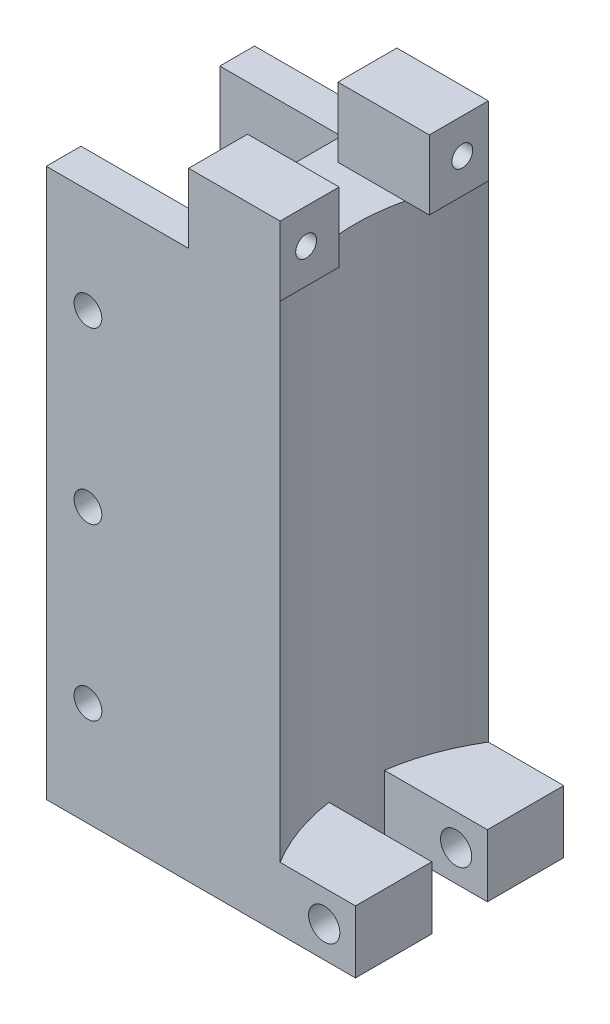
ISO-10303-21;
HEADER;
FILE_DESCRIPTION(('STEP AP214'),'2;1');
FILE_NAME('part.step','',(''),(''),'','','');
FILE_SCHEMA(('AUTOMOTIVE_DESIGN { 1 0 10303 214 1 1 1 1 }'));
ENDSEC;
DATA;
#1=APPLICATION_CONTEXT('core data for automotive mechanical design processes');
#2=APPLICATION_PROTOCOL_DEFINITION('international standard','automotive_design',2000,#1);
#3=PRODUCT_CONTEXT('',#1,'mechanical');
#4=PRODUCT('Part','Part','',(#3));
#5=PRODUCT_RELATED_PRODUCT_CATEGORY('part','',(#4));
#6=PRODUCT_DEFINITION_FORMATION('','',#4);
#7=PRODUCT_DEFINITION_CONTEXT('part definition',#1,'design');
#8=PRODUCT_DEFINITION('design','',#6,#7);
#9=PRODUCT_DEFINITION_SHAPE('','',#8);
#10=(LENGTH_UNIT() NAMED_UNIT(*) SI_UNIT(.MILLI.,.METRE.));
#11=(NAMED_UNIT(*) PLANE_ANGLE_UNIT() SI_UNIT($,.RADIAN.));
#12=(NAMED_UNIT(*) SI_UNIT($,.STERADIAN.) SOLID_ANGLE_UNIT());
#13=UNCERTAINTY_MEASURE_WITH_UNIT(LENGTH_MEASURE(1.E-05),#10,'distance_accuracy_value','');
#14=(GEOMETRIC_REPRESENTATION_CONTEXT(3) GLOBAL_UNCERTAINTY_ASSIGNED_CONTEXT((#13)) GLOBAL_UNIT_ASSIGNED_CONTEXT((#10,
#11,#12)) REPRESENTATION_CONTEXT('',''));
#15=CARTESIAN_POINT('',(0.,0.,0.));
#16=DIRECTION('',(0.,0.,1.));
#17=DIRECTION('',(1.,0.,0.));
#18=AXIS2_PLACEMENT_3D('',#15,#16,#17);
#19=CARTESIAN_POINT('',(8.84,39.5,-15.01));
#20=DIRECTION('',(1.,0.,0.));
#21=DIRECTION('',(0.,1.,0.));
#22=AXIS2_PLACEMENT_3D('',#19,#20,#21);
#23=PLANE('',#22);
#24=CARTESIAN_POINT('',(8.84,44.5,11.2500000000003));
#25=DIRECTION('',(-1.,0.,0.));
#26=DIRECTION('',(0.,0.,1.));
#27=AXIS2_PLACEMENT_3D('',#24,#25,#26);
#28=CIRCLE('',#27,1.5);
#29=CARTESIAN_POINT('',(8.84,44.5,12.7500000000003));
#30=VERTEX_POINT('',#29);
#31=EDGE_CURVE('E39',#30,#30,#28,.T.);
#32=ORIENTED_EDGE('',*,*,#31,.T.);
#33=EDGE_LOOP('',(#32));
#34=FACE_BOUND('',#33,.T.);
#35=DIRECTION('',(0.,-1.,0.));
#36=VECTOR('',#35,1.);
#37=CARTESIAN_POINT('',(8.84,49.5,6.5));
#38=LINE('',#37,#36);
#39=CARTESIAN_POINT('',(8.84,49.5,6.5));
#40=VERTEX_POINT('',#39);
#41=CARTESIAN_POINT('',(8.84,39.5,6.5));
#42=VERTEX_POINT('',#41);
#43=EDGE_CURVE('E343',#40,#42,#38,.T.);
#44=ORIENTED_EDGE('',*,*,#43,.F.);
#45=DIRECTION('',(0.,0.,-1.));
#46=VECTOR('',#45,1.);
#47=CARTESIAN_POINT('',(8.84,49.5,0.));
#48=LINE('',#47,#46);
#49=CARTESIAN_POINT('',(8.84,49.5,15.));
#50=VERTEX_POINT('',#49);
#51=EDGE_CURVE('E220',#50,#40,#48,.T.);
#52=ORIENTED_EDGE('',*,*,#51,.F.);
#53=DIRECTION('',(0.,-1.,0.));
#54=VECTOR('',#53,1.);
#55=CARTESIAN_POINT('',(8.83999999999999,0.,15.));
#56=LINE('',#55,#54);
#57=CARTESIAN_POINT('',(8.84,39.5,15.));
#58=VERTEX_POINT('',#57);
#59=EDGE_CURVE('E192',#50,#58,#56,.T.);
#60=ORIENTED_EDGE('',*,*,#59,.T.);
#61=DIRECTION('',(0.,0.,-1.));
#62=VECTOR('',#61,1.);
#63=CARTESIAN_POINT('',(8.84,39.5,0.));
#64=LINE('',#63,#62);
#65=EDGE_CURVE('E218',#58,#42,#64,.T.);
#66=ORIENTED_EDGE('',*,*,#65,.T.);
#67=EDGE_LOOP('',(#44,#52,#60,#66));
#68=FACE_BOUND('',#67,.T.);
#69=ADVANCED_FACE('F35',(#34,#68),#23,.T.);
#70=CARTESIAN_POINT('',(8.84,44.5,-11.25));
#71=DIRECTION('',(-1.,0.,0.));
#72=DIRECTION('',(0.,0.,1.));
#73=AXIS2_PLACEMENT_3D('',#70,#71,#72);
#74=CIRCLE('',#73,1.5);
#75=CARTESIAN_POINT('',(8.84,44.5,-9.75));
#76=VERTEX_POINT('',#75);
#77=EDGE_CURVE('E231',#76,#76,#74,.T.);
#78=ORIENTED_EDGE('',*,*,#77,.T.);
#79=EDGE_LOOP('',(#78));
#80=FACE_BOUND('',#79,.T.);
#81=DIRECTION('',(0.,-1.,0.));
#82=VECTOR('',#81,1.);
#83=CARTESIAN_POINT('',(8.83999999999999,0.,-15.));
#84=LINE('',#83,#82);
#85=CARTESIAN_POINT('',(8.84,49.5,-15.));
#86=VERTEX_POINT('',#85);
#87=CARTESIAN_POINT('',(8.84,39.5,-15.));
#88=VERTEX_POINT('',#87);
#89=EDGE_CURVE('E52',#86,#88,#84,.T.);
#90=ORIENTED_EDGE('',*,*,#89,.F.);
#91=CARTESIAN_POINT('',(8.84,49.5,-6.5));
#92=VERTEX_POINT('',#91);
#93=EDGE_CURVE('E346',#92,#86,#48,.T.);
#94=ORIENTED_EDGE('',*,*,#93,.F.);
#95=DIRECTION('',(0.,-1.,0.));
#96=VECTOR('',#95,1.);
#97=CARTESIAN_POINT('',(8.84,49.5,-6.5));
#98=LINE('',#97,#96);
#99=CARTESIAN_POINT('',(8.84,39.5,-6.5));
#100=VERTEX_POINT('',#99);
#101=EDGE_CURVE('E226',#92,#100,#98,.T.);
#102=ORIENTED_EDGE('',*,*,#101,.T.);
#103=EDGE_CURVE('E224',#100,#88,#64,.T.);
#104=ORIENTED_EDGE('',*,*,#103,.T.);
#105=EDGE_LOOP('',(#90,#94,#102,#104));
#106=FACE_BOUND('',#105,.T.);
#107=ADVANCED_FACE('F278',(#80,#106),#23,.T.);
#108=CARTESIAN_POINT('',(-7.34,-39.5,10.));
#109=DIRECTION('',(0.,0.,1.));
#110=DIRECTION('',(0.,-1.,0.));
#111=AXIS2_PLACEMENT_3D('',#108,#109,#110);
#112=PLANE('',#111);
#113=CARTESIAN_POINT('',(-18.84,24.5,10.));
#114=DIRECTION('',(0.,0.,1.));
#115=DIRECTION('',(0.,-1.,0.));
#116=AXIS2_PLACEMENT_3D('',#113,#114,#115);
#117=CIRCLE('',#116,2.);
#118=CARTESIAN_POINT('',(-18.84,22.5,10.));
#119=VERTEX_POINT('',#118);
#120=EDGE_CURVE('E383',#119,#119,#117,.T.);
#121=ORIENTED_EDGE('',*,*,#120,.T.);
#122=EDGE_LOOP('',(#121));
#123=FACE_BOUND('',#122,.T.);
#124=CARTESIAN_POINT('',(-18.84,-24.5,10.));
#125=DIRECTION('',(0.,0.,1.));
#126=DIRECTION('',(0.,-1.,0.));
#127=AXIS2_PLACEMENT_3D('',#124,#125,#126);
#128=CIRCLE('',#127,2.);
#129=CARTESIAN_POINT('',(-18.84,-26.5,10.));
#130=VERTEX_POINT('',#129);
#131=EDGE_CURVE('E373',#130,#130,#128,.T.);
#132=ORIENTED_EDGE('',*,*,#131,.T.);
#133=EDGE_LOOP('',(#132));
#134=FACE_BOUND('',#133,.T.);
#135=CARTESIAN_POINT('',(-18.8399999999999,0.,10.));
#136=DIRECTION('',(0.,0.,1.));
#137=DIRECTION('',(0.,-1.,0.));
#138=AXIS2_PLACEMENT_3D('',#135,#136,#137);
#139=CIRCLE('',#138,2.);
#140=CARTESIAN_POINT('',(-18.8399999999999,-2.,10.));
#141=VERTEX_POINT('',#140);
#142=EDGE_CURVE('E357',#141,#141,#139,.T.);
#143=ORIENTED_EDGE('',*,*,#142,.T.);
#144=EDGE_LOOP('',(#143));
#145=FACE_BOUND('',#144,.T.);
#146=DIRECTION('',(0.,1.,0.));
#147=VECTOR('',#146,1.);
#148=CARTESIAN_POINT('',(-24.84,0.,10.));
#149=LINE('',#148,#147);
#150=CARTESIAN_POINT('',(-24.84,-39.5,10.));
#151=VERTEX_POINT('',#150);
#152=CARTESIAN_POINT('',(-24.84,39.5,10.));
#153=VERTEX_POINT('',#152);
#154=EDGE_CURVE('E484',#151,#153,#149,.T.);
#155=ORIENTED_EDGE('',*,*,#154,.T.);
#156=DIRECTION('',(-1.,0.,0.));
#157=VECTOR('',#156,1.);
#158=CARTESIAN_POINT('',(-7.34,39.5,10.));
#159=LINE('',#158,#157);
#160=CARTESIAN_POINT('',(-7.34,39.5,10.));
#161=VERTEX_POINT('',#160);
#162=EDGE_CURVE('E408',#161,#153,#159,.T.);
#163=ORIENTED_EDGE('',*,*,#162,.F.);
#164=DIRECTION('',(0.,1.,0.));
#165=VECTOR('',#164,1.);
#166=CARTESIAN_POINT('',(-7.34,-39.5,10.));
#167=LINE('',#166,#165);
#168=CARTESIAN_POINT('',(-7.34,-39.5,10.));
#169=VERTEX_POINT('',#168);
#170=EDGE_CURVE('E399',#169,#161,#167,.T.);
#171=ORIENTED_EDGE('',*,*,#170,.F.);
#172=DIRECTION('',(-1.,0.,0.));
#173=VECTOR('',#172,1.);
#174=CARTESIAN_POINT('',(-7.34,-39.5,10.));
#175=LINE('',#174,#173);
#176=EDGE_CURVE('E412',#169,#151,#175,.T.);
#177=ORIENTED_EDGE('',*,*,#176,.T.);
#178=EDGE_LOOP('',(#155,#163,#171,#177));
#179=FACE_BOUND('',#178,.T.);
#180=ADVANCED_FACE('F275',(#123,#134,#145,#179),#112,.F.);
#181=CARTESIAN_POINT('',(-7.34,0.,0.));
#182=DIRECTION('',(1.,0.,0.));
#183=DIRECTION('',(0.,0.,-1.));
#184=AXIS2_PLACEMENT_3D('',#181,#182,#183);
#185=PLANE('',#184);
#186=DIRECTION('',(0.,-1.,0.));
#187=VECTOR('',#186,1.);
#188=CARTESIAN_POINT('',(-7.34,-39.5,-10.));
#189=LINE('',#188,#187);
#190=CARTESIAN_POINT('',(-7.34,39.5,-10.));
#191=VERTEX_POINT('',#190);
#192=CARTESIAN_POINT('',(-7.34,-39.5,-10.));
#193=VERTEX_POINT('',#192);
#194=EDGE_CURVE('E393',#191,#193,#189,.T.);
#195=ORIENTED_EDGE('',*,*,#194,.T.);
#196=DIRECTION('',(0.,0.,1.));
#197=VECTOR('',#196,1.);
#198=CARTESIAN_POINT('',(-7.34,-39.5,-10.));
#199=LINE('',#198,#197);
#200=EDGE_CURVE('E396',#193,#169,#199,.T.);
#201=ORIENTED_EDGE('',*,*,#200,.T.);
#202=ORIENTED_EDGE('',*,*,#170,.T.);
#203=DIRECTION('',(0.,0.,-1.));
#204=VECTOR('',#203,1.);
#205=CARTESIAN_POINT('',(-7.34,39.5,-10.));
#206=LINE('',#205,#204);
#207=EDGE_CURVE('E402',#161,#191,#206,.T.);
#208=ORIENTED_EDGE('',*,*,#207,.T.);
#209=EDGE_LOOP('',(#195,#201,#202,#208));
#210=FACE_BOUND('',#209,.T.);
#211=ADVANCED_FACE('F277',(#210),#185,.F.);
#212=CARTESIAN_POINT('',(-7.34,-39.5,-10.));
#213=DIRECTION('',(0.,0.,-1.));
#214=DIRECTION('',(0.,1.,0.));
#215=AXIS2_PLACEMENT_3D('',#212,#213,#214);
#216=PLANE('',#215);
#217=CARTESIAN_POINT('',(-18.84,24.5,-10.));
#218=DIRECTION('',(0.,0.,-1.));
#219=DIRECTION('',(0.,1.,0.));
#220=AXIS2_PLACEMENT_3D('',#217,#218,#219);
#221=CIRCLE('',#220,2.);
#222=CARTESIAN_POINT('',(-18.84,26.5,-10.));
#223=VERTEX_POINT('',#222);
#224=EDGE_CURVE('E384',#223,#223,#221,.T.);
#225=ORIENTED_EDGE('',*,*,#224,.T.);
#226=EDGE_LOOP('',(#225));
#227=FACE_BOUND('',#226,.T.);
#228=CARTESIAN_POINT('',(-18.84,-24.5,-10.));
#229=DIRECTION('',(0.,0.,-1.));
#230=DIRECTION('',(0.,1.,0.));
#231=AXIS2_PLACEMENT_3D('',#228,#229,#230);
#232=CIRCLE('',#231,2.);
#233=CARTESIAN_POINT('',(-18.84,-22.5,-10.));
#234=VERTEX_POINT('',#233);
#235=EDGE_CURVE('E374',#234,#234,#232,.T.);
#236=ORIENTED_EDGE('',*,*,#235,.T.);
#237=EDGE_LOOP('',(#236));
#238=FACE_BOUND('',#237,.T.);
#239=CARTESIAN_POINT('',(-18.8399999999999,0.,-10.));
#240=DIRECTION('',(0.,0.,-1.));
#241=DIRECTION('',(0.,1.,0.));
#242=AXIS2_PLACEMENT_3D('',#239,#240,#241);
#243=CIRCLE('',#242,2.);
#244=CARTESIAN_POINT('',(-18.8399999999999,2.,-10.));
#245=VERTEX_POINT('',#244);
#246=EDGE_CURVE('E364',#245,#245,#243,.T.);
#247=ORIENTED_EDGE('',*,*,#246,.T.);
#248=EDGE_LOOP('',(#247));
#249=FACE_BOUND('',#248,.T.);
#250=DIRECTION('',(0.,-1.,0.));
#251=VECTOR('',#250,1.);
#252=CARTESIAN_POINT('',(-24.84,0.,-10.));
#253=LINE('',#252,#251);
#254=CARTESIAN_POINT('',(-24.84,39.5,-10.));
#255=VERTEX_POINT('',#254);
#256=CARTESIAN_POINT('',(-24.84,-39.5,-10.));
#257=VERTEX_POINT('',#256);
#258=EDGE_CURVE('E345',#255,#257,#253,.T.);
#259=ORIENTED_EDGE('',*,*,#258,.T.);
#260=DIRECTION('',(-1.,0.,0.));
#261=VECTOR('',#260,1.);
#262=CARTESIAN_POINT('',(-7.34,-39.5,-10.));
#263=LINE('',#262,#261);
#264=EDGE_CURVE('E405',#193,#257,#263,.T.);
#265=ORIENTED_EDGE('',*,*,#264,.F.);
#266=ORIENTED_EDGE('',*,*,#194,.F.);
#267=DIRECTION('',(-1.,0.,0.));
#268=VECTOR('',#267,1.);
#269=CARTESIAN_POINT('',(-7.34,39.5,-10.));
#270=LINE('',#269,#268);
#271=EDGE_CURVE('E406',#191,#255,#270,.T.);
#272=ORIENTED_EDGE('',*,*,#271,.T.);
#273=EDGE_LOOP('',(#259,#265,#266,#272));
#274=FACE_BOUND('',#273,.T.);
#275=ADVANCED_FACE('F285',(#227,#238,#249,#274),#216,.F.);
#276=CARTESIAN_POINT('',(-8.841,0.,-4.));
#277=DIRECTION('',(0.,0.,-1.));
#278=DIRECTION('',(-1.,0.,0.));
#279=AXIS2_PLACEMENT_3D('',#276,#277,#278);
#280=PLANE('',#279);
#281=DIRECTION('',(0.,1.,0.));
#282=VECTOR('',#281,1.);
#283=CARTESIAN_POINT('',(4.88287123180948,-30.5,-4.));
#284=LINE('',#283,#282);
#285=CARTESIAN_POINT('',(4.88287123180948,-30.5,-4.));
#286=VERTEX_POINT('',#285);
#287=CARTESIAN_POINT('',(4.88287123180948,-39.5,-4.));
#288=VERTEX_POINT('',#287);
#289=EDGE_CURVE('E436',#286,#288,#284,.F.);
#290=ORIENTED_EDGE('',*,*,#289,.T.);
#291=DIRECTION('',(1.,0.,0.));
#292=VECTOR('',#291,1.);
#293=CARTESIAN_POINT('',(-8.841,-39.5,-4.));
#294=LINE('',#293,#292);
#295=CARTESIAN_POINT('',(19.7,-39.5,-4.));
#296=VERTEX_POINT('',#295);
#297=EDGE_CURVE('E441',#288,#296,#294,.T.);
#298=ORIENTED_EDGE('',*,*,#297,.T.);
#299=DIRECTION('',(0.,1.,0.));
#300=VECTOR('',#299,1.);
#301=CARTESIAN_POINT('',(19.7,0.,-4.));
#302=LINE('',#301,#300);
#303=CARTESIAN_POINT('',(19.7,-30.5,-4.));
#304=VERTEX_POINT('',#303);
#305=EDGE_CURVE('E429',#296,#304,#302,.T.);
#306=ORIENTED_EDGE('',*,*,#305,.T.);
#307=DIRECTION('',(1.,0.,0.));
#308=VECTOR('',#307,1.);
#309=CARTESIAN_POINT('',(-8.841,-30.5,-4.));
#310=LINE('',#309,#308);
#311=EDGE_CURVE('E446',#286,#304,#310,.T.);
#312=ORIENTED_EDGE('',*,*,#311,.F.);
#313=EDGE_LOOP('',(#290,#298,#306,#312));
#314=FACE_BOUND('',#313,.T.);
#315=CARTESIAN_POINT('',(15.2,-35.,-4.));
#316=DIRECTION('',(0.,0.,-1.));
#317=DIRECTION('',(-1.,0.,0.));
#318=AXIS2_PLACEMENT_3D('',#315,#316,#317);
#319=CIRCLE('',#318,2.25);
#320=CARTESIAN_POINT('',(12.95,-35.,-4.));
#321=VERTEX_POINT('',#320);
#322=EDGE_CURVE('E451',#321,#321,#319,.F.);
#323=ORIENTED_EDGE('',*,*,#322,.F.);
#324=EDGE_LOOP('',(#323));
#325=FACE_BOUND('',#324,.T.);
#326=ADVANCED_FACE('F526',(#314,#325),#280,.F.);
#327=CARTESIAN_POINT('',(-8.841,0.,4.));
#328=DIRECTION('',(0.,0.,-1.));
#329=DIRECTION('',(-1.,0.,0.));
#330=AXIS2_PLACEMENT_3D('',#327,#328,#329);
#331=PLANE('',#330);
#332=DIRECTION('',(1.,0.,0.));
#333=VECTOR('',#332,1.);
#334=CARTESIAN_POINT('',(-8.841,-30.5,4.));
#335=LINE('',#334,#333);
#336=CARTESIAN_POINT('',(4.88287123180948,-30.5,4.));
#337=VERTEX_POINT('',#336);
#338=CARTESIAN_POINT('',(19.7,-30.5,4.));
#339=VERTEX_POINT('',#338);
#340=EDGE_CURVE('E444',#337,#339,#335,.T.);
#341=ORIENTED_EDGE('',*,*,#340,.T.);
#342=DIRECTION('',(0.,1.,0.));
#343=VECTOR('',#342,1.);
#344=CARTESIAN_POINT('',(19.7,0.,4.));
#345=LINE('',#344,#343);
#346=CARTESIAN_POINT('',(19.7,-39.5,4.));
#347=VERTEX_POINT('',#346);
#348=EDGE_CURVE('E438',#347,#339,#345,.T.);
#349=ORIENTED_EDGE('',*,*,#348,.F.);
#350=DIRECTION('',(1.,0.,0.));
#351=VECTOR('',#350,1.);
#352=CARTESIAN_POINT('',(-8.841,-39.5,4.));
#353=LINE('',#352,#351);
#354=CARTESIAN_POINT('',(4.88287123180948,-39.5,4.));
#355=VERTEX_POINT('',#354);
#356=EDGE_CURVE('E432',#355,#347,#353,.T.);
#357=ORIENTED_EDGE('',*,*,#356,.F.);
#358=DIRECTION('',(0.,1.,0.));
#359=VECTOR('',#358,1.);
#360=CARTESIAN_POINT('',(4.88287123180948,-30.5,4.));
#361=LINE('',#360,#359);
#362=EDGE_CURVE('E430',#337,#355,#361,.F.);
#363=ORIENTED_EDGE('',*,*,#362,.F.);
#364=EDGE_LOOP('',(#341,#349,#357,#363));
#365=FACE_BOUND('',#364,.T.);
#366=CARTESIAN_POINT('',(15.2,-35.,4.));
#367=DIRECTION('',(0.,0.,-1.));
#368=DIRECTION('',(-1.,0.,0.));
#369=AXIS2_PLACEMENT_3D('',#366,#367,#368);
#370=CIRCLE('',#369,2.25);
#371=CARTESIAN_POINT('',(12.95,-35.,4.));
#372=VERTEX_POINT('',#371);
#373=EDGE_CURVE('E455',#372,#372,#370,.F.);
#374=ORIENTED_EDGE('',*,*,#373,.T.);
#375=EDGE_LOOP('',(#374));
#376=FACE_BOUND('',#375,.T.);
#377=ADVANCED_FACE('F523',(#365,#376),#331,.T.);
#378=CARTESIAN_POINT('',(0.,-30.5,0.));
#379=DIRECTION('',(0.,1.,0.));
#380=DIRECTION('',(0.,0.,1.));
#381=AXIS2_PLACEMENT_3D('',#378,#379,#380);
#382=PLANE('',#381);
#383=DIRECTION('',(0.,0.,1.));
#384=VECTOR('',#383,1.);
#385=CARTESIAN_POINT('',(19.7,-30.5,-15.));
#386=LINE('',#385,#384);
#387=CARTESIAN_POINT('',(19.7,-30.5,15.));
#388=VERTEX_POINT('',#387);
#389=EDGE_CURVE('E462',#339,#388,#386,.T.);
#390=ORIENTED_EDGE('',*,*,#389,.F.);
#391=ORIENTED_EDGE('',*,*,#340,.F.);
#392=CARTESIAN_POINT('',(33.2694718769498,-30.5,0.));
#393=DIRECTION('',(0.,1.,0.));
#394=DIRECTION('',(0.,0.,1.));
#395=AXIS2_PLACEMENT_3D('',#392,#393,#394);
#396=CIRCLE('',#395,28.6670384969686);
#397=CARTESIAN_POINT('',(8.84,-30.5,15.));
#398=VERTEX_POINT('',#397);
#399=EDGE_CURVE('E200',#398,#337,#396,.F.);
#400=ORIENTED_EDGE('',*,*,#399,.F.);
#401=DIRECTION('',(-1.,0.,0.));
#402=VECTOR('',#401,1.);
#403=CARTESIAN_POINT('',(19.7,-30.5,15.));
#404=LINE('',#403,#402);
#405=EDGE_CURVE('E196',#388,#398,#404,.T.);
#406=ORIENTED_EDGE('',*,*,#405,.F.);
#407=EDGE_LOOP('',(#390,#391,#400,#406));
#408=FACE_BOUND('',#407,.T.);
#409=ADVANCED_FACE('F525',(#408),#382,.T.);
#410=CARTESIAN_POINT('',(19.7,0.,0.));
#411=DIRECTION('',(1.,0.,0.));
#412=DIRECTION('',(0.,0.,-1.));
#413=AXIS2_PLACEMENT_3D('',#410,#411,#412);
#414=PLANE('',#413);
#415=DIRECTION('',(0.,0.,-1.));
#416=VECTOR('',#415,1.);
#417=CARTESIAN_POINT('',(19.7,-39.5,15.));
#418=LINE('',#417,#416);
#419=CARTESIAN_POINT('',(19.7,-39.5,15.));
#420=VERTEX_POINT('',#419);
#421=EDGE_CURVE('E470',#420,#347,#418,.T.);
#422=ORIENTED_EDGE('',*,*,#421,.T.);
#423=ORIENTED_EDGE('',*,*,#348,.T.);
#424=ORIENTED_EDGE('',*,*,#389,.T.);
#425=DIRECTION('',(0.,-1.,0.));
#426=VECTOR('',#425,1.);
#427=CARTESIAN_POINT('',(19.7,-30.5,15.));
#428=LINE('',#427,#426);
#429=EDGE_CURVE('E466',#388,#420,#428,.T.);
#430=ORIENTED_EDGE('',*,*,#429,.T.);
#431=EDGE_LOOP('',(#422,#423,#424,#430));
#432=FACE_BOUND('',#431,.T.);
#433=ADVANCED_FACE('F533',(#432),#414,.T.);
#434=CARTESIAN_POINT('',(-24.84,0.,15.));
#435=DIRECTION('',(-1.,0.,0.));
#436=DIRECTION('',(0.,-1.,0.));
#437=AXIS2_PLACEMENT_3D('',#434,#435,#436);
#438=PLANE('',#437);
#439=ORIENTED_EDGE('',*,*,#154,.F.);
#440=DIRECTION('',(0.,0.,-1.));
#441=VECTOR('',#440,1.);
#442=CARTESIAN_POINT('',(-24.84,-39.5,15.));
#443=LINE('',#442,#441);
#444=CARTESIAN_POINT('',(-24.84,-39.5,15.));
#445=VERTEX_POINT('',#444);
#446=EDGE_CURVE('E422',#445,#151,#443,.T.);
#447=ORIENTED_EDGE('',*,*,#446,.F.);
#448=DIRECTION('',(0.,1.,0.));
#449=VECTOR('',#448,1.);
#450=CARTESIAN_POINT('',(-24.84,0.,15.));
#451=LINE('',#450,#449);
#452=CARTESIAN_POINT('',(-24.84,39.5,15.));
#453=VERTEX_POINT('',#452);
#454=EDGE_CURVE('E416',#445,#453,#451,.T.);
#455=ORIENTED_EDGE('',*,*,#454,.T.);
#456=DIRECTION('',(0.,0.,-1.));
#457=VECTOR('',#456,1.);
#458=CARTESIAN_POINT('',(-24.84,39.5,15.));
#459=LINE('',#458,#457);
#460=EDGE_CURVE('E426',#453,#153,#459,.T.);
#461=ORIENTED_EDGE('',*,*,#460,.T.);
#462=EDGE_LOOP('',(#439,#447,#455,#461));
#463=FACE_BOUND('',#462,.T.);
#464=ADVANCED_FACE('F518',(#463),#438,.T.);
#465=CARTESIAN_POINT('',(15.2,-35.,35.86));
#466=DIRECTION('',(0.,0.,-1.));
#467=DIRECTION('',(-1.,0.,0.));
#468=AXIS2_PLACEMENT_3D('',#465,#466,#467);
#469=CYLINDRICAL_SURFACE('',#468,2.25);
#470=CARTESIAN_POINT('',(15.2,-35.,15.));
#471=DIRECTION('',(0.,0.,-1.));
#472=DIRECTION('',(-1.,0.,0.));
#473=AXIS2_PLACEMENT_3D('',#470,#471,#472);
#474=CIRCLE('',#473,2.25);
#475=CARTESIAN_POINT('',(12.95,-35.,15.));
#476=VERTEX_POINT('',#475);
#477=EDGE_CURVE('E456',#476,#476,#474,.T.);
#478=ORIENTED_EDGE('',*,*,#477,.F.);
#479=EDGE_LOOP('',(#478));
#480=FACE_BOUND('',#479,.T.);
#481=ORIENTED_EDGE('',*,*,#373,.F.);
#482=EDGE_LOOP('',(#481));
#483=FACE_BOUND('',#482,.T.);
#484=ADVANCED_FACE('F298',(#480,#483),#469,.F.);
#485=CARTESIAN_POINT('',(-18.8399999999999,0.,-25.));
#486=DIRECTION('',(0.,0.,1.));
#487=DIRECTION('',(1.,0.,0.));
#488=AXIS2_PLACEMENT_3D('',#485,#486,#487);
#489=CYLINDRICAL_SURFACE('',#488,2.);
#490=ORIENTED_EDGE('',*,*,#142,.F.);
#491=EDGE_LOOP('',(#490));
#492=FACE_BOUND('',#491,.T.);
#493=CARTESIAN_POINT('',(-18.8399999999999,0.,15.));
#494=DIRECTION('',(0.,0.,-1.));
#495=DIRECTION('',(-1.,0.,0.));
#496=AXIS2_PLACEMENT_3D('',#493,#494,#495);
#497=CIRCLE('',#496,2.);
#498=CARTESIAN_POINT('',(-20.8399999999999,0.,15.));
#499=VERTEX_POINT('',#498);
#500=EDGE_CURVE('E370',#499,#499,#497,.T.);
#501=ORIENTED_EDGE('',*,*,#500,.F.);
#502=EDGE_LOOP('',(#501));
#503=FACE_BOUND('',#502,.T.);
#504=ADVANCED_FACE('F294',(#492,#503),#489,.F.);
#505=CARTESIAN_POINT('',(-18.84,-24.5,-25.));
#506=DIRECTION('',(0.,0.,1.));
#507=DIRECTION('',(1.,0.,0.));
#508=AXIS2_PLACEMENT_3D('',#505,#506,#507);
#509=CYLINDRICAL_SURFACE('',#508,2.);
#510=ORIENTED_EDGE('',*,*,#131,.F.);
#511=EDGE_LOOP('',(#510));
#512=FACE_BOUND('',#511,.T.);
#513=CARTESIAN_POINT('',(-18.84,-24.5,15.));
#514=DIRECTION('',(0.,0.,-1.));
#515=DIRECTION('',(-1.,0.,0.));
#516=AXIS2_PLACEMENT_3D('',#513,#514,#515);
#517=CIRCLE('',#516,2.);
#518=CARTESIAN_POINT('',(-20.84,-24.5,15.));
#519=VERTEX_POINT('',#518);
#520=EDGE_CURVE('E380',#519,#519,#517,.T.);
#521=ORIENTED_EDGE('',*,*,#520,.F.);
#522=EDGE_LOOP('',(#521));
#523=FACE_BOUND('',#522,.T.);
#524=ADVANCED_FACE('F297',(#512,#523),#509,.F.);
#525=CARTESIAN_POINT('',(-18.84,24.5,-25.));
#526=DIRECTION('',(0.,0.,1.));
#527=DIRECTION('',(1.,0.,0.));
#528=AXIS2_PLACEMENT_3D('',#525,#526,#527);
#529=CYLINDRICAL_SURFACE('',#528,2.);
#530=ORIENTED_EDGE('',*,*,#120,.F.);
#531=EDGE_LOOP('',(#530));
#532=FACE_BOUND('',#531,.T.);
#533=CARTESIAN_POINT('',(-18.84,24.5,15.));
#534=DIRECTION('',(0.,0.,-1.));
#535=DIRECTION('',(-1.,0.,0.));
#536=AXIS2_PLACEMENT_3D('',#533,#534,#535);
#537=CIRCLE('',#536,2.);
#538=CARTESIAN_POINT('',(-20.84,24.5,15.));
#539=VERTEX_POINT('',#538);
#540=EDGE_CURVE('E390',#539,#539,#537,.T.);
#541=ORIENTED_EDGE('',*,*,#540,.F.);
#542=EDGE_LOOP('',(#541));
#543=FACE_BOUND('',#542,.T.);
#544=ADVANCED_FACE('F303',(#532,#543),#529,.F.);
#545=CARTESIAN_POINT('',(0.,0.,15.));
#546=DIRECTION('',(0.,0.,-1.));
#547=DIRECTION('',(-1.,0.,0.));
#548=AXIS2_PLACEMENT_3D('',#545,#546,#547);
#549=PLANE('',#548);
#550=ORIENTED_EDGE('',*,*,#540,.T.);
#551=EDGE_LOOP('',(#550));
#552=FACE_BOUND('',#551,.T.);
#553=ORIENTED_EDGE('',*,*,#520,.T.);
#554=EDGE_LOOP('',(#553));
#555=FACE_BOUND('',#554,.T.);
#556=ORIENTED_EDGE('',*,*,#500,.T.);
#557=EDGE_LOOP('',(#556));
#558=FACE_BOUND('',#557,.T.);
#559=ORIENTED_EDGE('',*,*,#477,.T.);
#560=EDGE_LOOP('',(#559));
#561=FACE_BOUND('',#560,.T.);
#562=ORIENTED_EDGE('',*,*,#59,.F.);
#563=DIRECTION('',(1.,0.,0.));
#564=VECTOR('',#563,1.);
#565=CARTESIAN_POINT('',(0.,49.5,15.));
#566=LINE('',#565,#564);
#567=CARTESIAN_POINT('',(-4.33999999999999,49.5,15.));
#568=VERTEX_POINT('',#567);
#569=EDGE_CURVE('E232',#568,#50,#566,.T.);
#570=ORIENTED_EDGE('',*,*,#569,.F.);
#571=DIRECTION('',(0.,-1.,0.));
#572=VECTOR('',#571,1.);
#573=CARTESIAN_POINT('',(-4.33999999999999,49.5,15.));
#574=LINE('',#573,#572);
#575=CARTESIAN_POINT('',(-4.33999999999999,39.5,15.));
#576=VERTEX_POINT('',#575);
#577=EDGE_CURVE('E235',#568,#576,#574,.T.);
#578=ORIENTED_EDGE('',*,*,#577,.T.);
#579=DIRECTION('',(-1.,0.,0.));
#580=VECTOR('',#579,1.);
#581=CARTESIAN_POINT('',(-8.84,39.5,15.));
#582=LINE('',#581,#580);
#583=EDGE_CURVE('E483',#576,#453,#582,.T.);
#584=ORIENTED_EDGE('',*,*,#583,.T.);
#585=ORIENTED_EDGE('',*,*,#454,.F.);
#586=DIRECTION('',(1.,0.,0.));
#587=VECTOR('',#586,1.);
#588=CARTESIAN_POINT('',(-8.84,-39.5,15.));
#589=LINE('',#588,#587);
#590=EDGE_CURVE('E481',#445,#420,#589,.T.);
#591=ORIENTED_EDGE('',*,*,#590,.T.);
#592=ORIENTED_EDGE('',*,*,#429,.F.);
#593=ORIENTED_EDGE('',*,*,#405,.T.);
#594=DIRECTION('',(0.,1.,0.));
#595=VECTOR('',#594,1.);
#596=CARTESIAN_POINT('',(8.84,-30.5,15.));
#597=LINE('',#596,#595);
#598=EDGE_CURVE('E187',#398,#58,#597,.T.);
#599=ORIENTED_EDGE('',*,*,#598,.T.);
#600=EDGE_LOOP('',(#562,#570,#578,#584,#585,#591,#592,#593,#599));
#601=FACE_BOUND('',#600,.T.);
#602=ADVANCED_FACE('F189',(#552,#555,#558,#561,#601),#549,.F.);
#603=ORIENTED_EDGE('',*,*,#258,.F.);
#604=CARTESIAN_POINT('',(-24.84,39.5,-15.));
#605=VERTEX_POINT('',#604);
#606=EDGE_CURVE('E425',#255,#605,#459,.T.);
#607=ORIENTED_EDGE('',*,*,#606,.T.);
#608=DIRECTION('',(0.,1.,0.));
#609=VECTOR('',#608,1.);
#610=CARTESIAN_POINT('',(-24.84,0.,-15.));
#611=LINE('',#610,#609);
#612=CARTESIAN_POINT('',(-24.84,-39.5,-15.));
#613=VERTEX_POINT('',#612);
#614=EDGE_CURVE('E409',#613,#605,#611,.T.);
#615=ORIENTED_EDGE('',*,*,#614,.F.);
#616=EDGE_CURVE('E419',#257,#613,#443,.T.);
#617=ORIENTED_EDGE('',*,*,#616,.F.);
#618=EDGE_LOOP('',(#603,#607,#615,#617));
#619=FACE_BOUND('',#618,.T.);
#620=ADVANCED_FACE('F508',(#619),#438,.T.);
#621=CARTESIAN_POINT('',(-8.84,-39.5,15.));
#622=DIRECTION('',(0.,1.,0.));
#623=DIRECTION('',(0.,0.,1.));
#624=AXIS2_PLACEMENT_3D('',#621,#622,#623);
#625=PLANE('',#624);
#626=ORIENTED_EDGE('',*,*,#200,.F.);
#627=ORIENTED_EDGE('',*,*,#264,.T.);
#628=ORIENTED_EDGE('',*,*,#616,.T.);
#629=DIRECTION('',(1.,0.,0.));
#630=VECTOR('',#629,1.);
#631=CARTESIAN_POINT('',(-8.84,-39.5,-15.));
#632=LINE('',#631,#630);
#633=CARTESIAN_POINT('',(19.7,-39.5,-15.));
#634=VERTEX_POINT('',#633);
#635=EDGE_CURVE('E485',#613,#634,#632,.T.);
#636=ORIENTED_EDGE('',*,*,#635,.T.);
#637=EDGE_CURVE('E469',#296,#634,#418,.T.);
#638=ORIENTED_EDGE('',*,*,#637,.F.);
#639=ORIENTED_EDGE('',*,*,#297,.F.);
#640=CARTESIAN_POINT('',(33.2694718769498,-39.5,0.));
#641=DIRECTION('',(0.,-1.,0.));
#642=DIRECTION('',(0.,0.,-1.));
#643=AXIS2_PLACEMENT_3D('',#640,#641,#642);
#644=CIRCLE('',#643,28.6670384969686);
#645=EDGE_CURVE('E433',#288,#355,#644,.F.);
#646=ORIENTED_EDGE('',*,*,#645,.T.);
#647=ORIENTED_EDGE('',*,*,#356,.T.);
#648=ORIENTED_EDGE('',*,*,#421,.F.);
#649=ORIENTED_EDGE('',*,*,#590,.F.);
#650=ORIENTED_EDGE('',*,*,#446,.T.);
#651=ORIENTED_EDGE('',*,*,#176,.F.);
#652=EDGE_LOOP('',(#626,#627,#628,#636,#638,#639,#646,#647,#648,#649,#650,#651));
#653=FACE_BOUND('',#652,.T.);
#654=ADVANCED_FACE('F549',(#653),#625,.F.);
#655=ORIENTED_EDGE('',*,*,#305,.F.);
#656=ORIENTED_EDGE('',*,*,#637,.T.);
#657=DIRECTION('',(0.,1.,0.));
#658=VECTOR('',#657,1.);
#659=CARTESIAN_POINT('',(19.7,-39.5,-15.));
#660=LINE('',#659,#658);
#661=CARTESIAN_POINT('',(19.7,-30.5,-15.));
#662=VERTEX_POINT('',#661);
#663=EDGE_CURVE('E459',#634,#662,#660,.T.);
#664=ORIENTED_EDGE('',*,*,#663,.T.);
#665=EDGE_CURVE('E463',#662,#304,#386,.T.);
#666=ORIENTED_EDGE('',*,*,#665,.T.);
#667=EDGE_LOOP('',(#655,#656,#664,#666));
#668=FACE_BOUND('',#667,.T.);
#669=ADVANCED_FACE('F546',(#668),#414,.T.);
#670=ORIENTED_EDGE('',*,*,#311,.T.);
#671=ORIENTED_EDGE('',*,*,#665,.F.);
#672=DIRECTION('',(-1.,0.,0.));
#673=VECTOR('',#672,1.);
#674=CARTESIAN_POINT('',(19.7,-30.5,-15.));
#675=LINE('',#674,#673);
#676=CARTESIAN_POINT('',(8.84,-30.5,-15.));
#677=VERTEX_POINT('',#676);
#678=EDGE_CURVE('E474',#662,#677,#675,.T.);
#679=ORIENTED_EDGE('',*,*,#678,.T.);
#680=EDGE_CURVE('E477',#286,#677,#396,.F.);
#681=ORIENTED_EDGE('',*,*,#680,.F.);
#682=EDGE_LOOP('',(#670,#671,#679,#681));
#683=FACE_BOUND('',#682,.T.);
#684=ADVANCED_FACE('F536',(#683),#382,.T.);
#685=CARTESIAN_POINT('',(33.2694718769498,-30.5,0.));
#686=DIRECTION('',(0.,1.,0.));
#687=DIRECTION('',(0.,0.,1.));
#688=AXIS2_PLACEMENT_3D('',#685,#686,#687);
#689=CYLINDRICAL_SURFACE('',#688,28.6670384969686);
#690=CARTESIAN_POINT('',(33.2694718769498,39.5,0.));
#691=DIRECTION('',(0.,1.,0.));
#692=DIRECTION('',(0.,0.,1.));
#693=AXIS2_PLACEMENT_3D('',#690,#691,#692);
#694=CIRCLE('',#693,28.6670384969686);
#695=CARTESIAN_POINT('',(5.3490654295737,39.5,6.5));
#696=VERTEX_POINT('',#695);
#697=EDGE_CURVE('E205',#58,#696,#694,.F.);
#698=ORIENTED_EDGE('',*,*,#697,.F.);
#699=ORIENTED_EDGE('',*,*,#598,.F.);
#700=ORIENTED_EDGE('',*,*,#399,.T.);
#701=ORIENTED_EDGE('',*,*,#362,.T.);
#702=ORIENTED_EDGE('',*,*,#645,.F.);
#703=ORIENTED_EDGE('',*,*,#289,.F.);
#704=ORIENTED_EDGE('',*,*,#680,.T.);
#705=DIRECTION('',(0.,1.,0.));
#706=VECTOR('',#705,1.);
#707=CARTESIAN_POINT('',(8.84,-30.5,-15.));
#708=LINE('',#707,#706);
#709=EDGE_CURVE('E201',#677,#88,#708,.T.);
#710=ORIENTED_EDGE('',*,*,#709,.T.);
#711=CARTESIAN_POINT('',(5.3490654295737,39.5,-6.5));
#712=VERTEX_POINT('',#711);
#713=EDGE_CURVE('E215',#712,#88,#694,.F.);
#714=ORIENTED_EDGE('',*,*,#713,.F.);
#715=EDGE_CURVE('E208',#696,#712,#694,.F.);
#716=ORIENTED_EDGE('',*,*,#715,.F.);
#717=EDGE_LOOP('',(#698,#699,#700,#701,#702,#703,#704,#710,#714,#716));
#718=FACE_BOUND('',#717,.T.);
#719=ADVANCED_FACE('F206',(#718),#689,.F.);
#720=CARTESIAN_POINT('',(-4.33999999999999,49.5,0.));
#721=DIRECTION('',(1.,0.,0.));
#722=DIRECTION('',(0.,0.,-1.));
#723=AXIS2_PLACEMENT_3D('',#720,#721,#722);
#724=PLANE('',#723);
#725=CARTESIAN_POINT('',(-4.33999999999999,44.5,11.2500000000003));
#726=DIRECTION('',(1.,0.,0.));
#727=DIRECTION('',(0.,0.,-1.));
#728=AXIS2_PLACEMENT_3D('',#725,#726,#727);
#729=CIRCLE('',#728,1.5);
#730=CARTESIAN_POINT('',(-4.33999999999999,44.5,9.75000000000031));
#731=VERTEX_POINT('',#730);
#732=EDGE_CURVE('E44',#731,#731,#729,.F.);
#733=ORIENTED_EDGE('',*,*,#732,.F.);
#734=EDGE_LOOP('',(#733));
#735=FACE_BOUND('',#734,.T.);
#736=DIRECTION('',(0.,0.,1.));
#737=VECTOR('',#736,1.);
#738=CARTESIAN_POINT('',(-4.33999999999999,39.5,0.));
#739=LINE('',#738,#737);
#740=CARTESIAN_POINT('',(-4.33999999999999,39.5,6.5));
#741=VERTEX_POINT('',#740);
#742=EDGE_CURVE('E239',#741,#576,#739,.T.);
#743=ORIENTED_EDGE('',*,*,#742,.T.);
#744=ORIENTED_EDGE('',*,*,#577,.F.);
#745=DIRECTION('',(0.,0.,1.));
#746=VECTOR('',#745,1.);
#747=CARTESIAN_POINT('',(-4.33999999999999,49.5,0.));
#748=LINE('',#747,#746);
#749=CARTESIAN_POINT('',(-4.33999999999999,49.5,6.5));
#750=VERTEX_POINT('',#749);
#751=EDGE_CURVE('E234',#750,#568,#748,.T.);
#752=ORIENTED_EDGE('',*,*,#751,.F.);
#753=DIRECTION('',(0.,-1.,0.));
#754=VECTOR('',#753,1.);
#755=CARTESIAN_POINT('',(-4.33999999999999,49.5,6.5));
#756=LINE('',#755,#754);
#757=EDGE_CURVE('E353',#750,#741,#756,.T.);
#758=ORIENTED_EDGE('',*,*,#757,.T.);
#759=EDGE_LOOP('',(#743,#744,#752,#758));
#760=FACE_BOUND('',#759,.T.);
#761=ADVANCED_FACE('F260',(#735,#760),#724,.F.);
#762=CARTESIAN_POINT('',(-6.16,44.5,11.2500000000003));
#763=DIRECTION('',(1.,0.,0.));
#764=DIRECTION('',(0.,0.,-1.));
#765=AXIS2_PLACEMENT_3D('',#762,#763,#764);
#766=CYLINDRICAL_SURFACE('',#765,1.5);
#767=ORIENTED_EDGE('',*,*,#732,.T.);
#768=EDGE_LOOP('',(#767));
#769=FACE_BOUND('',#768,.T.);
#770=ORIENTED_EDGE('',*,*,#31,.F.);
#771=EDGE_LOOP('',(#770));
#772=FACE_BOUND('',#771,.T.);
#773=ADVANCED_FACE('F257',(#769,#772),#766,.F.);
#774=CARTESIAN_POINT('',(0.,39.5,0.));
#775=DIRECTION('',(0.,1.,0.));
#776=DIRECTION('',(0.,0.,1.));
#777=AXIS2_PLACEMENT_3D('',#774,#775,#776);
#778=PLANE('',#777);
#779=ORIENTED_EDGE('',*,*,#103,.F.);
#780=DIRECTION('',(1.,0.,0.));
#781=VECTOR('',#780,1.);
#782=CARTESIAN_POINT('',(0.,39.5,-6.5));
#783=LINE('',#782,#781);
#784=EDGE_CURVE('E249',#712,#100,#783,.T.);
#785=ORIENTED_EDGE('',*,*,#784,.F.);
#786=ORIENTED_EDGE('',*,*,#713,.T.);
#787=EDGE_LOOP('',(#779,#785,#786));
#788=FACE_BOUND('',#787,.T.);
#789=ADVANCED_FACE('F259',(#788),#778,.F.);
#790=CARTESIAN_POINT('',(-8.84,39.5,15.));
#791=DIRECTION('',(0.,-1.,0.));
#792=DIRECTION('',(0.,0.,-1.));
#793=AXIS2_PLACEMENT_3D('',#790,#791,#792);
#794=PLANE('',#793);
#795=DIRECTION('',(0.,0.,1.));
#796=VECTOR('',#795,1.);
#797=CARTESIAN_POINT('',(-4.33999999999999,39.5,0.));
#798=LINE('',#797,#796);
#799=CARTESIAN_POINT('',(-4.33999999999999,39.5,-15.));
#800=VERTEX_POINT('',#799);
#801=CARTESIAN_POINT('',(-4.33999999999999,39.5,-6.5));
#802=VERTEX_POINT('',#801);
#803=EDGE_CURVE('E328',#800,#802,#798,.T.);
#804=ORIENTED_EDGE('',*,*,#803,.F.);
#805=DIRECTION('',(-1.,0.,0.));
#806=VECTOR('',#805,1.);
#807=CARTESIAN_POINT('',(-8.84,39.5,-15.));
#808=LINE('',#807,#806);
#809=EDGE_CURVE('E213',#800,#605,#808,.T.);
#810=ORIENTED_EDGE('',*,*,#809,.T.);
#811=ORIENTED_EDGE('',*,*,#606,.F.);
#812=ORIENTED_EDGE('',*,*,#271,.F.);
#813=ORIENTED_EDGE('',*,*,#207,.F.);
#814=ORIENTED_EDGE('',*,*,#162,.T.);
#815=ORIENTED_EDGE('',*,*,#460,.F.);
#816=ORIENTED_EDGE('',*,*,#583,.F.);
#817=ORIENTED_EDGE('',*,*,#742,.F.);
#818=DIRECTION('',(1.,0.,0.));
#819=VECTOR('',#818,1.);
#820=CARTESIAN_POINT('',(0.,39.5,6.5));
#821=LINE('',#820,#819);
#822=EDGE_CURVE('E240',#741,#696,#821,.T.);
#823=ORIENTED_EDGE('',*,*,#822,.T.);
#824=ORIENTED_EDGE('',*,*,#715,.T.);
#825=EDGE_CURVE('E247',#802,#712,#783,.T.);
#826=ORIENTED_EDGE('',*,*,#825,.F.);
#827=EDGE_LOOP('',(#804,#810,#811,#812,#813,#814,#815,#816,#817,#823,#824,#826));
#828=FACE_BOUND('',#827,.T.);
#829=ADVANCED_FACE('F267',(#828),#794,.F.);
#830=CARTESIAN_POINT('',(-4.33999999999999,49.5,0.));
#831=DIRECTION('',(1.,0.,0.));
#832=DIRECTION('',(0.,0.,-1.));
#833=AXIS2_PLACEMENT_3D('',#830,#831,#832);
#834=PLANE('',#833);
#835=CARTESIAN_POINT('',(-4.34,44.5,-11.25));
#836=DIRECTION('',(1.,0.,0.));
#837=DIRECTION('',(0.,0.,-1.));
#838=AXIS2_PLACEMENT_3D('',#835,#836,#837);
#839=CIRCLE('',#838,1.5);
#840=CARTESIAN_POINT('',(-4.34,44.5,-12.75));
#841=VERTEX_POINT('',#840);
#842=EDGE_CURVE('E11',#841,#841,#839,.T.);
#843=ORIENTED_EDGE('',*,*,#842,.T.);
#844=EDGE_LOOP('',(#843));
#845=FACE_BOUND('',#844,.T.);
#846=ORIENTED_EDGE('',*,*,#803,.T.);
#847=DIRECTION('',(0.,-1.,0.));
#848=VECTOR('',#847,1.);
#849=CARTESIAN_POINT('',(-4.33999999999999,49.5,-6.5));
#850=LINE('',#849,#848);
#851=CARTESIAN_POINT('',(-4.33999999999999,49.5,-6.5));
#852=VERTEX_POINT('',#851);
#853=EDGE_CURVE('E245',#852,#802,#850,.T.);
#854=ORIENTED_EDGE('',*,*,#853,.F.);
#855=DIRECTION('',(0.,0.,1.));
#856=VECTOR('',#855,1.);
#857=CARTESIAN_POINT('',(-4.33999999999999,49.5,0.));
#858=LINE('',#857,#856);
#859=CARTESIAN_POINT('',(-4.33999999999999,49.5,-15.));
#860=VERTEX_POINT('',#859);
#861=EDGE_CURVE('E244',#860,#852,#858,.T.);
#862=ORIENTED_EDGE('',*,*,#861,.F.);
#863=DIRECTION('',(0.,-1.,0.));
#864=VECTOR('',#863,1.);
#865=CARTESIAN_POINT('',(-4.33999999999999,49.5,-15.));
#866=LINE('',#865,#864);
#867=EDGE_CURVE('E332',#860,#800,#866,.T.);
#868=ORIENTED_EDGE('',*,*,#867,.T.);
#869=EDGE_LOOP('',(#846,#854,#862,#868));
#870=FACE_BOUND('',#869,.T.);
#871=ADVANCED_FACE('F310',(#845,#870),#834,.F.);
#872=CARTESIAN_POINT('',(-6.16,44.5,-11.25));
#873=DIRECTION('',(1.,0.,0.));
#874=DIRECTION('',(0.,0.,-1.));
#875=AXIS2_PLACEMENT_3D('',#872,#873,#874);
#876=CYLINDRICAL_SURFACE('',#875,1.5);
#877=ORIENTED_EDGE('',*,*,#77,.F.);
#878=EDGE_LOOP('',(#877));
#879=FACE_BOUND('',#878,.T.);
#880=ORIENTED_EDGE('',*,*,#842,.F.);
#881=EDGE_LOOP('',(#880));
#882=FACE_BOUND('',#881,.T.);
#883=ADVANCED_FACE('F312',(#879,#882),#876,.F.);
#884=CARTESIAN_POINT('',(0.,49.5,0.));
#885=DIRECTION('',(0.,1.,0.));
#886=DIRECTION('',(0.,0.,1.));
#887=AXIS2_PLACEMENT_3D('',#884,#885,#886);
#888=PLANE('',#887);
#889=DIRECTION('',(1.,0.,0.));
#890=VECTOR('',#889,1.);
#891=CARTESIAN_POINT('',(0.,49.5,-6.5));
#892=LINE('',#891,#890);
#893=EDGE_CURVE('E242',#852,#92,#892,.T.);
#894=ORIENTED_EDGE('',*,*,#893,.T.);
#895=ORIENTED_EDGE('',*,*,#93,.T.);
#896=DIRECTION('',(-1.,0.,0.));
#897=VECTOR('',#896,1.);
#898=CARTESIAN_POINT('',(0.,49.5,-15.));
#899=LINE('',#898,#897);
#900=EDGE_CURVE('E59',#86,#860,#899,.T.);
#901=ORIENTED_EDGE('',*,*,#900,.T.);
#902=ORIENTED_EDGE('',*,*,#861,.T.);
#903=EDGE_LOOP('',(#894,#895,#901,#902));
#904=FACE_BOUND('',#903,.T.);
#905=ADVANCED_FACE('F315',(#904),#888,.T.);
#906=CARTESIAN_POINT('',(0.,49.5,-6.5));
#907=DIRECTION('',(0.,0.,-1.));
#908=DIRECTION('',(-1.,0.,0.));
#909=AXIS2_PLACEMENT_3D('',#906,#907,#908);
#910=PLANE('',#909);
#911=ORIENTED_EDGE('',*,*,#101,.F.);
#912=ORIENTED_EDGE('',*,*,#893,.F.);
#913=ORIENTED_EDGE('',*,*,#853,.T.);
#914=ORIENTED_EDGE('',*,*,#825,.T.);
#915=ORIENTED_EDGE('',*,*,#784,.T.);
#916=EDGE_LOOP('',(#911,#912,#913,#914,#915));
#917=FACE_BOUND('',#916,.T.);
#918=ADVANCED_FACE('F37',(#917),#910,.F.);
#919=ORIENTED_EDGE('',*,*,#65,.F.);
#920=ORIENTED_EDGE('',*,*,#697,.T.);
#921=EDGE_CURVE('E223',#696,#42,#821,.T.);
#922=ORIENTED_EDGE('',*,*,#921,.T.);
#923=EDGE_LOOP('',(#919,#920,#922));
#924=FACE_BOUND('',#923,.T.);
#925=ADVANCED_FACE('F222',(#924),#778,.F.);
#926=ORIENTED_EDGE('',*,*,#569,.T.);
#927=ORIENTED_EDGE('',*,*,#51,.T.);
#928=DIRECTION('',(1.,0.,0.));
#929=VECTOR('',#928,1.);
#930=CARTESIAN_POINT('',(0.,49.5,6.5));
#931=LINE('',#930,#929);
#932=EDGE_CURVE('E236',#750,#40,#931,.T.);
#933=ORIENTED_EDGE('',*,*,#932,.F.);
#934=ORIENTED_EDGE('',*,*,#751,.T.);
#935=EDGE_LOOP('',(#926,#927,#933,#934));
#936=FACE_BOUND('',#935,.T.);
#937=ADVANCED_FACE('F321',(#936),#888,.T.);
#938=CARTESIAN_POINT('',(0.,49.5,6.5));
#939=DIRECTION('',(0.,0.,-1.));
#940=DIRECTION('',(-1.,0.,0.));
#941=AXIS2_PLACEMENT_3D('',#938,#939,#940);
#942=PLANE('',#941);
#943=ORIENTED_EDGE('',*,*,#932,.T.);
#944=ORIENTED_EDGE('',*,*,#43,.T.);
#945=ORIENTED_EDGE('',*,*,#921,.F.);
#946=ORIENTED_EDGE('',*,*,#822,.F.);
#947=ORIENTED_EDGE('',*,*,#757,.F.);
#948=EDGE_LOOP('',(#943,#944,#945,#946,#947));
#949=FACE_BOUND('',#948,.T.);
#950=ADVANCED_FACE('F351',(#949),#942,.T.);
#951=ORIENTED_EDGE('',*,*,#322,.T.);
#952=EDGE_LOOP('',(#951));
#953=FACE_BOUND('',#952,.T.);
#954=CARTESIAN_POINT('',(15.2,-35.,-15.));
#955=DIRECTION('',(0.,0.,-1.));
#956=DIRECTION('',(-1.,0.,0.));
#957=AXIS2_PLACEMENT_3D('',#954,#955,#956);
#958=CIRCLE('',#957,2.25);
#959=CARTESIAN_POINT('',(12.95,-35.,-15.));
#960=VERTEX_POINT('',#959);
#961=EDGE_CURVE('E452',#960,#960,#958,.T.);
#962=ORIENTED_EDGE('',*,*,#961,.T.);
#963=EDGE_LOOP('',(#962));
#964=FACE_BOUND('',#963,.T.);
#965=ADVANCED_FACE('F520',(#953,#964),#469,.F.);
#966=CARTESIAN_POINT('',(-18.8399999999999,0.,-15.));
#967=DIRECTION('',(0.,0.,-1.));
#968=DIRECTION('',(-1.,0.,0.));
#969=AXIS2_PLACEMENT_3D('',#966,#967,#968);
#970=CIRCLE('',#969,2.);
#971=CARTESIAN_POINT('',(-20.8399999999999,0.,-15.));
#972=VERTEX_POINT('',#971);
#973=EDGE_CURVE('E367',#972,#972,#970,.T.);
#974=ORIENTED_EDGE('',*,*,#973,.T.);
#975=EDGE_LOOP('',(#974));
#976=FACE_BOUND('',#975,.T.);
#977=ORIENTED_EDGE('',*,*,#246,.F.);
#978=EDGE_LOOP('',(#977));
#979=FACE_BOUND('',#978,.T.);
#980=ADVANCED_FACE('F300',(#976,#979),#489,.F.);
#981=CARTESIAN_POINT('',(-18.84,-24.5,-15.));
#982=DIRECTION('',(0.,0.,-1.));
#983=DIRECTION('',(-1.,0.,0.));
#984=AXIS2_PLACEMENT_3D('',#981,#982,#983);
#985=CIRCLE('',#984,2.);
#986=CARTESIAN_POINT('',(-20.84,-24.5,-15.));
#987=VERTEX_POINT('',#986);
#988=EDGE_CURVE('E377',#987,#987,#985,.T.);
#989=ORIENTED_EDGE('',*,*,#988,.T.);
#990=EDGE_LOOP('',(#989));
#991=FACE_BOUND('',#990,.T.);
#992=ORIENTED_EDGE('',*,*,#235,.F.);
#993=EDGE_LOOP('',(#992));
#994=FACE_BOUND('',#993,.T.);
#995=ADVANCED_FACE('F305',(#991,#994),#509,.F.);
#996=CARTESIAN_POINT('',(-18.84,24.5,-15.));
#997=DIRECTION('',(0.,0.,-1.));
#998=DIRECTION('',(-1.,0.,0.));
#999=AXIS2_PLACEMENT_3D('',#996,#997,#998);
#1000=CIRCLE('',#999,2.);
#1001=CARTESIAN_POINT('',(-20.84,24.5,-15.));
#1002=VERTEX_POINT('',#1001);
#1003=EDGE_CURVE('E387',#1002,#1002,#1000,.T.);
#1004=ORIENTED_EDGE('',*,*,#1003,.T.);
#1005=EDGE_LOOP('',(#1004));
#1006=FACE_BOUND('',#1005,.T.);
#1007=ORIENTED_EDGE('',*,*,#224,.F.);
#1008=EDGE_LOOP('',(#1007));
#1009=FACE_BOUND('',#1008,.T.);
#1010=ADVANCED_FACE('F308',(#1006,#1009),#529,.F.);
#1011=CARTESIAN_POINT('',(0.,0.,-15.));
#1012=DIRECTION('',(0.,0.,-1.));
#1013=DIRECTION('',(-1.,0.,0.));
#1014=AXIS2_PLACEMENT_3D('',#1011,#1012,#1013);
#1015=PLANE('',#1014);
#1016=ORIENTED_EDGE('',*,*,#1003,.F.);
#1017=EDGE_LOOP('',(#1016));
#1018=FACE_BOUND('',#1017,.T.);
#1019=ORIENTED_EDGE('',*,*,#988,.F.);
#1020=EDGE_LOOP('',(#1019));
#1021=FACE_BOUND('',#1020,.T.);
#1022=ORIENTED_EDGE('',*,*,#973,.F.);
#1023=EDGE_LOOP('',(#1022));
#1024=FACE_BOUND('',#1023,.T.);
#1025=ORIENTED_EDGE('',*,*,#961,.F.);
#1026=EDGE_LOOP('',(#1025));
#1027=FACE_BOUND('',#1026,.T.);
#1028=ORIENTED_EDGE('',*,*,#900,.F.);
#1029=ORIENTED_EDGE('',*,*,#89,.T.);
#1030=ORIENTED_EDGE('',*,*,#709,.F.);
#1031=ORIENTED_EDGE('',*,*,#678,.F.);
#1032=ORIENTED_EDGE('',*,*,#663,.F.);
#1033=ORIENTED_EDGE('',*,*,#635,.F.);
#1034=ORIENTED_EDGE('',*,*,#614,.T.);
#1035=ORIENTED_EDGE('',*,*,#809,.F.);
#1036=ORIENTED_EDGE('',*,*,#867,.F.);
#1037=EDGE_LOOP('',(#1028,#1029,#1030,#1031,#1032,#1033,#1034,#1035,#1036));
#1038=FACE_BOUND('',#1037,.T.);
#1039=ADVANCED_FACE('F565',(#1018,#1021,#1024,#1027,#1038),#1015,.T.);
#1040=CLOSED_SHELL('',(#69,#107,#180,#211,#275,#326,#377,#409,#433,#464,#484,#504,#524,#544,
#602,#620,#654,#669,#684,#719,#761,#773,#789,#829,#871,#883,#905,#918,#925,#937,#950,#965,#980,
#995,#1010,#1039));
#1041=MANIFOLD_SOLID_BREP('B2',#1040);
#1042=ADVANCED_BREP_SHAPE_REPRESENTATION('',(#18,#1041),#14);
#1043=SHAPE_DEFINITION_REPRESENTATION(#9,#1042);
ENDSEC;
END-ISO-10303-21;
